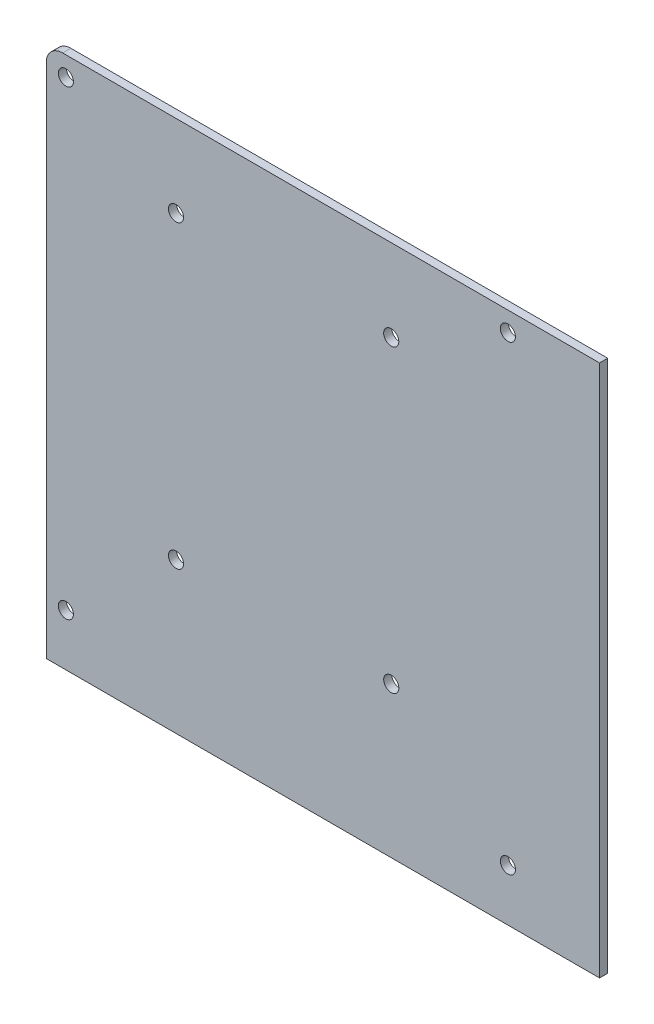
ISO-10303-21;
HEADER;
FILE_DESCRIPTION(('STEP AP214'),'2;1');
FILE_NAME('part.step','',(''),(''),'','','');
FILE_SCHEMA(('AUTOMOTIVE_DESIGN { 1 0 10303 214 1 1 1 1 }'));
ENDSEC;
DATA;
#1=APPLICATION_CONTEXT('core data for automotive mechanical design processes');
#2=APPLICATION_PROTOCOL_DEFINITION('international standard','automotive_design',2000,#1);
#3=PRODUCT_CONTEXT('',#1,'mechanical');
#4=PRODUCT('Part','Part','',(#3));
#5=PRODUCT_RELATED_PRODUCT_CATEGORY('part','',(#4));
#6=PRODUCT_DEFINITION_FORMATION('','',#4);
#7=PRODUCT_DEFINITION_CONTEXT('part definition',#1,'design');
#8=PRODUCT_DEFINITION('design','',#6,#7);
#9=PRODUCT_DEFINITION_SHAPE('','',#8);
#10=(LENGTH_UNIT() NAMED_UNIT(*) SI_UNIT(.MILLI.,.METRE.));
#11=(NAMED_UNIT(*) PLANE_ANGLE_UNIT() SI_UNIT($,.RADIAN.));
#12=(NAMED_UNIT(*) SI_UNIT($,.STERADIAN.) SOLID_ANGLE_UNIT());
#13=UNCERTAINTY_MEASURE_WITH_UNIT(LENGTH_MEASURE(1.E-05),#10,'distance_accuracy_value','');
#14=(GEOMETRIC_REPRESENTATION_CONTEXT(3) GLOBAL_UNCERTAINTY_ASSIGNED_CONTEXT((#13)) GLOBAL_UNIT_ASSIGNED_CONTEXT((#10,
#11,#12)) REPRESENTATION_CONTEXT('',''));
#15=CARTESIAN_POINT('',(0.,0.,0.));
#16=DIRECTION('',(0.,0.,1.));
#17=DIRECTION('',(1.,0.,0.));
#18=AXIS2_PLACEMENT_3D('',#15,#16,#17);
#19=CARTESIAN_POINT('',(0.,0.,1.5875));
#20=DIRECTION('',(1.,0.,0.));
#21=DIRECTION('',(0.,0.,-1.));
#22=AXIS2_PLACEMENT_3D('',#19,#20,#21);
#23=PLANE('',#22);
#24=DIRECTION('',(0.,0.,1.));
#25=VECTOR('',#24,1.);
#26=CARTESIAN_POINT('',(0.,277.294971959545,0.));
#27=LINE('',#26,#25);
#28=CARTESIAN_POINT('',(0.,277.294971959545,0.));
#29=VERTEX_POINT('',#28);
#30=CARTESIAN_POINT('',(0.,277.294971959545,1.5875));
#31=VERTEX_POINT('',#30);
#32=EDGE_CURVE('E123',#29,#31,#27,.T.);
#33=ORIENTED_EDGE('',*,*,#32,.T.);
#34=DIRECTION('',(0.,-1.,0.));
#35=VECTOR('',#34,1.);
#36=CARTESIAN_POINT('',(0.,0.,1.5875));
#37=LINE('',#36,#35);
#38=CARTESIAN_POINT('',(0.,377.825,1.5875));
#39=VERTEX_POINT('',#38);
#40=EDGE_CURVE('E97',#39,#31,#37,.T.);
#41=ORIENTED_EDGE('',*,*,#40,.F.);
#42=DIRECTION('',(0.,0.,-1.));
#43=VECTOR('',#42,1.);
#44=CARTESIAN_POINT('',(0.,377.825,1.5875));
#45=LINE('',#44,#43);
#46=CARTESIAN_POINT('',(0.,377.825,0.));
#47=VERTEX_POINT('',#46);
#48=EDGE_CURVE('E41',#39,#47,#45,.T.);
#49=ORIENTED_EDGE('',*,*,#48,.T.);
#50=DIRECTION('',(0.,-1.,0.));
#51=VECTOR('',#50,1.);
#52=CARTESIAN_POINT('',(0.,0.,0.));
#53=LINE('',#52,#51);
#54=EDGE_CURVE('E98',#47,#29,#53,.T.);
#55=ORIENTED_EDGE('',*,*,#54,.T.);
#56=EDGE_LOOP('',(#33,#41,#49,#55));
#57=FACE_BOUND('',#56,.T.);
#58=ADVANCED_FACE('F33',(#57),#23,.F.);
#59=CARTESIAN_POINT('',(0.,0.,1.5875));
#60=DIRECTION('',(0.,0.,-1.));
#61=DIRECTION('',(-1.,0.,0.));
#62=AXIS2_PLACEMENT_3D('',#59,#60,#61);
#63=PLANE('',#62);
#64=CARTESIAN_POINT('',(89.8652,377.19,1.5875));
#65=DIRECTION('',(0.,0.,1.));
#66=DIRECTION('',(-1.,0.,0.));
#67=AXIS2_PLACEMENT_3D('',#64,#65,#66);
#68=CIRCLE('',#67,1.47319999999994);
#69=CARTESIAN_POINT('',(88.3920000000001,377.19,1.5875));
#70=VERTEX_POINT('',#69);
#71=EDGE_CURVE('E166',#70,#70,#68,.T.);
#72=ORIENTED_EDGE('',*,*,#71,.F.);
#73=EDGE_LOOP('',(#72));
#74=FACE_BOUND('',#73,.T.);
#75=CARTESIAN_POINT('',(3.81,377.19,1.5875));
#76=DIRECTION('',(0.,0.,1.));
#77=DIRECTION('',(1.,0.,0.));
#78=AXIS2_PLACEMENT_3D('',#75,#76,#77);
#79=CIRCLE('',#78,1.47319999999995);
#80=CARTESIAN_POINT('',(5.28319999999995,377.19,1.5875));
#81=VERTEX_POINT('',#80);
#82=EDGE_CURVE('E160',#81,#81,#79,.T.);
#83=ORIENTED_EDGE('',*,*,#82,.F.);
#84=EDGE_LOOP('',(#83));
#85=FACE_BOUND('',#84,.T.);
#86=CARTESIAN_POINT('',(89.8652,287.3756,1.5875));
#87=DIRECTION('',(0.,0.,1.));
#88=DIRECTION('',(1.,0.,0.));
#89=AXIS2_PLACEMENT_3D('',#86,#87,#88);
#90=CIRCLE('',#89,1.47319999999997);
#91=CARTESIAN_POINT('',(91.3384,287.3756,1.5875));
#92=VERTEX_POINT('',#91);
#93=EDGE_CURVE('E154',#92,#92,#90,.T.);
#94=ORIENTED_EDGE('',*,*,#93,.F.);
#95=EDGE_LOOP('',(#94));
#96=FACE_BOUND('',#95,.T.);
#97=CARTESIAN_POINT('',(3.80999999999998,287.3756,1.5875));
#98=DIRECTION('',(0.,0.,1.));
#99=DIRECTION('',(1.,0.,0.));
#100=AXIS2_PLACEMENT_3D('',#97,#98,#99);
#101=CIRCLE('',#100,1.47319999999995);
#102=CARTESIAN_POINT('',(5.28319999999993,287.3756,1.5875));
#103=VERTEX_POINT('',#102);
#104=EDGE_CURVE('E148',#103,#103,#101,.T.);
#105=ORIENTED_EDGE('',*,*,#104,.F.);
#106=EDGE_LOOP('',(#105));
#107=FACE_BOUND('',#106,.T.);
#108=CARTESIAN_POINT('',(25.2476,365.0234,1.5875));
#109=DIRECTION('',(0.,0.,1.));
#110=DIRECTION('',(1.,0.,0.));
#111=AXIS2_PLACEMENT_3D('',#108,#109,#110);
#112=CIRCLE('',#111,1.4732);
#113=CARTESIAN_POINT('',(26.7208,365.0234,1.5875));
#114=VERTEX_POINT('',#113);
#115=EDGE_CURVE('E142',#114,#114,#112,.T.);
#116=ORIENTED_EDGE('',*,*,#115,.F.);
#117=EDGE_LOOP('',(#116));
#118=FACE_BOUND('',#117,.T.);
#119=CARTESIAN_POINT('',(67.1576,365.0234,1.5875));
#120=DIRECTION('',(0.,0.,1.));
#121=DIRECTION('',(-1.,0.,0.));
#122=AXIS2_PLACEMENT_3D('',#119,#120,#121);
#123=CIRCLE('',#122,1.4732);
#124=CARTESIAN_POINT('',(65.6844,365.0234,1.5875));
#125=VERTEX_POINT('',#124);
#126=EDGE_CURVE('E136',#125,#125,#123,.T.);
#127=ORIENTED_EDGE('',*,*,#126,.F.);
#128=EDGE_LOOP('',(#127));
#129=FACE_BOUND('',#128,.T.);
#130=CARTESIAN_POINT('',(67.1576,306.6034,1.5875));
#131=DIRECTION('',(0.,0.,1.));
#132=DIRECTION('',(1.,0.,0.));
#133=AXIS2_PLACEMENT_3D('',#130,#131,#132);
#134=CIRCLE('',#133,1.4732);
#135=CARTESIAN_POINT('',(68.6308,306.6034,1.5875));
#136=VERTEX_POINT('',#135);
#137=EDGE_CURVE('E130',#136,#136,#134,.T.);
#138=ORIENTED_EDGE('',*,*,#137,.F.);
#139=EDGE_LOOP('',(#138));
#140=FACE_BOUND('',#139,.T.);
#141=CARTESIAN_POINT('',(25.2476,306.6034,1.5875));
#142=DIRECTION('',(0.,0.,1.));
#143=DIRECTION('',(-1.,0.,0.));
#144=AXIS2_PLACEMENT_3D('',#141,#142,#143);
#145=CIRCLE('',#144,1.4732);
#146=CARTESIAN_POINT('',(23.7744,306.6034,1.5875));
#147=VERTEX_POINT('',#146);
#148=EDGE_CURVE('E125',#147,#147,#145,.T.);
#149=ORIENTED_EDGE('',*,*,#148,.F.);
#150=EDGE_LOOP('',(#149));
#151=FACE_BOUND('',#150,.T.);
#152=DIRECTION('',(1.,0.,0.));
#153=VECTOR('',#152,1.);
#154=CARTESIAN_POINT('',(0.,277.294971959545,1.5875));
#155=LINE('',#154,#153);
#156=CARTESIAN_POINT('',(107.714500618971,277.294971959545,1.5875));
#157=VERTEX_POINT('',#156);
#158=EDGE_CURVE('E86',#31,#157,#155,.T.);
#159=ORIENTED_EDGE('',*,*,#158,.T.);
#160=DIRECTION('',(0.,-1.,0.));
#161=VECTOR('',#160,1.);
#162=CARTESIAN_POINT('',(107.714500618971,0.,1.5875));
#163=LINE('',#162,#161);
#164=CARTESIAN_POINT('',(107.714500618971,381.,1.5875));
#165=VERTEX_POINT('',#164);
#166=EDGE_CURVE('E119',#165,#157,#163,.T.);
#167=ORIENTED_EDGE('',*,*,#166,.F.);
#168=DIRECTION('',(-1.,0.,0.));
#169=VECTOR('',#168,1.);
#170=CARTESIAN_POINT('',(0.,381.,1.5875));
#171=LINE('',#170,#169);
#172=CARTESIAN_POINT('',(3.175,381.,1.5875));
#173=VERTEX_POINT('',#172);
#174=EDGE_CURVE('E56',#165,#173,#171,.T.);
#175=ORIENTED_EDGE('',*,*,#174,.T.);
#176=CARTESIAN_POINT('',(3.175,377.825,1.5875));
#177=DIRECTION('',(0.,0.,-1.));
#178=DIRECTION('',(-1.,0.,0.));
#179=AXIS2_PLACEMENT_3D('',#176,#177,#178);
#180=CIRCLE('',#179,3.175);
#181=EDGE_CURVE('E108',#173,#39,#180,.F.);
#182=ORIENTED_EDGE('',*,*,#181,.T.);
#183=ORIENTED_EDGE('',*,*,#40,.T.);
#184=EDGE_LOOP('',(#159,#167,#175,#182,#183));
#185=FACE_BOUND('',#184,.T.);
#186=ADVANCED_FACE('F176',(#74,#85,#96,#107,#118,#129,#140,#151,#185),#63,.F.);
#187=CARTESIAN_POINT('',(0.,0.,0.));
#188=DIRECTION('',(0.,0.,-1.));
#189=DIRECTION('',(-1.,0.,0.));
#190=AXIS2_PLACEMENT_3D('',#187,#188,#189);
#191=PLANE('',#190);
#192=CARTESIAN_POINT('',(89.8652,377.19,0.));
#193=DIRECTION('',(0.,0.,1.));
#194=DIRECTION('',(-1.,0.,0.));
#195=AXIS2_PLACEMENT_3D('',#192,#193,#194);
#196=CIRCLE('',#195,1.47319999999994);
#197=CARTESIAN_POINT('',(88.3920000000001,377.19,0.));
#198=VERTEX_POINT('',#197);
#199=EDGE_CURVE('E103',#198,#198,#196,.T.);
#200=ORIENTED_EDGE('',*,*,#199,.T.);
#201=EDGE_LOOP('',(#200));
#202=FACE_BOUND('',#201,.T.);
#203=CARTESIAN_POINT('',(3.81,377.19,0.));
#204=DIRECTION('',(0.,0.,1.));
#205=DIRECTION('',(1.,0.,0.));
#206=AXIS2_PLACEMENT_3D('',#203,#204,#205);
#207=CIRCLE('',#206,1.47319999999995);
#208=CARTESIAN_POINT('',(5.28319999999995,377.19,0.));
#209=VERTEX_POINT('',#208);
#210=EDGE_CURVE('E163',#209,#209,#207,.T.);
#211=ORIENTED_EDGE('',*,*,#210,.T.);
#212=EDGE_LOOP('',(#211));
#213=FACE_BOUND('',#212,.T.);
#214=CARTESIAN_POINT('',(89.8652,287.3756,0.));
#215=DIRECTION('',(0.,0.,1.));
#216=DIRECTION('',(1.,0.,0.));
#217=AXIS2_PLACEMENT_3D('',#214,#215,#216);
#218=CIRCLE('',#217,1.47319999999997);
#219=CARTESIAN_POINT('',(91.3384,287.3756,0.));
#220=VERTEX_POINT('',#219);
#221=EDGE_CURVE('E157',#220,#220,#218,.T.);
#222=ORIENTED_EDGE('',*,*,#221,.T.);
#223=EDGE_LOOP('',(#222));
#224=FACE_BOUND('',#223,.T.);
#225=CARTESIAN_POINT('',(3.80999999999998,287.3756,0.));
#226=DIRECTION('',(0.,0.,1.));
#227=DIRECTION('',(1.,0.,0.));
#228=AXIS2_PLACEMENT_3D('',#225,#226,#227);
#229=CIRCLE('',#228,1.47319999999995);
#230=CARTESIAN_POINT('',(5.28319999999993,287.3756,0.));
#231=VERTEX_POINT('',#230);
#232=EDGE_CURVE('E151',#231,#231,#229,.T.);
#233=ORIENTED_EDGE('',*,*,#232,.T.);
#234=EDGE_LOOP('',(#233));
#235=FACE_BOUND('',#234,.T.);
#236=CARTESIAN_POINT('',(25.2476,365.0234,0.));
#237=DIRECTION('',(0.,0.,1.));
#238=DIRECTION('',(1.,0.,0.));
#239=AXIS2_PLACEMENT_3D('',#236,#237,#238);
#240=CIRCLE('',#239,1.4732);
#241=CARTESIAN_POINT('',(26.7208,365.0234,0.));
#242=VERTEX_POINT('',#241);
#243=EDGE_CURVE('E145',#242,#242,#240,.T.);
#244=ORIENTED_EDGE('',*,*,#243,.T.);
#245=EDGE_LOOP('',(#244));
#246=FACE_BOUND('',#245,.T.);
#247=CARTESIAN_POINT('',(67.1576,365.0234,0.));
#248=DIRECTION('',(0.,0.,1.));
#249=DIRECTION('',(-1.,0.,0.));
#250=AXIS2_PLACEMENT_3D('',#247,#248,#249);
#251=CIRCLE('',#250,1.4732);
#252=CARTESIAN_POINT('',(65.6844,365.0234,0.));
#253=VERTEX_POINT('',#252);
#254=EDGE_CURVE('E139',#253,#253,#251,.T.);
#255=ORIENTED_EDGE('',*,*,#254,.T.);
#256=EDGE_LOOP('',(#255));
#257=FACE_BOUND('',#256,.T.);
#258=CARTESIAN_POINT('',(67.1576,306.6034,0.));
#259=DIRECTION('',(0.,0.,1.));
#260=DIRECTION('',(1.,0.,0.));
#261=AXIS2_PLACEMENT_3D('',#258,#259,#260);
#262=CIRCLE('',#261,1.4732);
#263=CARTESIAN_POINT('',(68.6308,306.6034,0.));
#264=VERTEX_POINT('',#263);
#265=EDGE_CURVE('E133',#264,#264,#262,.T.);
#266=ORIENTED_EDGE('',*,*,#265,.T.);
#267=EDGE_LOOP('',(#266));
#268=FACE_BOUND('',#267,.T.);
#269=CARTESIAN_POINT('',(25.2476,306.6034,0.));
#270=DIRECTION('',(0.,0.,1.));
#271=DIRECTION('',(-1.,0.,0.));
#272=AXIS2_PLACEMENT_3D('',#269,#270,#271);
#273=CIRCLE('',#272,1.4732);
#274=CARTESIAN_POINT('',(23.7744,306.6034,0.));
#275=VERTEX_POINT('',#274);
#276=EDGE_CURVE('E127',#275,#275,#273,.T.);
#277=ORIENTED_EDGE('',*,*,#276,.T.);
#278=EDGE_LOOP('',(#277));
#279=FACE_BOUND('',#278,.T.);
#280=DIRECTION('',(0.,-1.,0.));
#281=VECTOR('',#280,1.);
#282=CARTESIAN_POINT('',(107.714500618971,0.,0.));
#283=LINE('',#282,#281);
#284=CARTESIAN_POINT('',(107.714500618971,381.,0.));
#285=VERTEX_POINT('',#284);
#286=CARTESIAN_POINT('',(107.714500618971,277.294971959545,0.));
#287=VERTEX_POINT('',#286);
#288=EDGE_CURVE('E78',#285,#287,#283,.T.);
#289=ORIENTED_EDGE('',*,*,#288,.T.);
#290=DIRECTION('',(1.,0.,0.));
#291=VECTOR('',#290,1.);
#292=CARTESIAN_POINT('',(0.,277.294971959545,0.));
#293=LINE('',#292,#291);
#294=EDGE_CURVE('E85',#29,#287,#293,.T.);
#295=ORIENTED_EDGE('',*,*,#294,.F.);
#296=ORIENTED_EDGE('',*,*,#54,.F.);
#297=CARTESIAN_POINT('',(3.175,377.825,0.));
#298=DIRECTION('',(0.,0.,-1.));
#299=DIRECTION('',(-1.,0.,0.));
#300=AXIS2_PLACEMENT_3D('',#297,#298,#299);
#301=CIRCLE('',#300,3.175);
#302=CARTESIAN_POINT('',(3.175,381.,0.));
#303=VERTEX_POINT('',#302);
#304=EDGE_CURVE('E95',#47,#303,#301,.T.);
#305=ORIENTED_EDGE('',*,*,#304,.T.);
#306=DIRECTION('',(-1.,0.,0.));
#307=VECTOR('',#306,1.);
#308=CARTESIAN_POINT('',(0.,381.,0.));
#309=LINE('',#308,#307);
#310=EDGE_CURVE('E90',#285,#303,#309,.T.);
#311=ORIENTED_EDGE('',*,*,#310,.F.);
#312=EDGE_LOOP('',(#289,#295,#296,#305,#311));
#313=FACE_BOUND('',#312,.T.);
#314=ADVANCED_FACE('F93',(#202,#213,#224,#235,#246,#257,#268,#279,#313),#191,.T.);
#315=CARTESIAN_POINT('',(0.,381.,1.5875));
#316=DIRECTION('',(0.,-1.,0.));
#317=DIRECTION('',(0.,0.,-1.));
#318=AXIS2_PLACEMENT_3D('',#315,#316,#317);
#319=PLANE('',#318);
#320=ORIENTED_EDGE('',*,*,#174,.F.);
#321=DIRECTION('',(0.,0.,1.));
#322=VECTOR('',#321,1.);
#323=CARTESIAN_POINT('',(107.714500618971,381.,0.));
#324=LINE('',#323,#322);
#325=EDGE_CURVE('E81',#285,#165,#324,.T.);
#326=ORIENTED_EDGE('',*,*,#325,.F.);
#327=ORIENTED_EDGE('',*,*,#310,.T.);
#328=DIRECTION('',(0.,0.,-1.));
#329=VECTOR('',#328,1.);
#330=CARTESIAN_POINT('',(3.175,381.,1.5875));
#331=LINE('',#330,#329);
#332=EDGE_CURVE('E11',#303,#173,#331,.F.);
#333=ORIENTED_EDGE('',*,*,#332,.T.);
#334=EDGE_LOOP('',(#320,#326,#327,#333));
#335=FACE_BOUND('',#334,.T.);
#336=ADVANCED_FACE('F89',(#335),#319,.F.);
#337=CARTESIAN_POINT('',(89.8652,377.19,0.));
#338=DIRECTION('',(0.,0.,1.));
#339=DIRECTION('',(1.,0.,0.));
#340=AXIS2_PLACEMENT_3D('',#337,#338,#339);
#341=CYLINDRICAL_SURFACE('',#340,1.47319999999994);
#342=ORIENTED_EDGE('',*,*,#199,.F.);
#343=EDGE_LOOP('',(#342));
#344=FACE_BOUND('',#343,.T.);
#345=ORIENTED_EDGE('',*,*,#71,.T.);
#346=EDGE_LOOP('',(#345));
#347=FACE_BOUND('',#346,.T.);
#348=ADVANCED_FACE('F174',(#344,#347),#341,.F.);
#349=CARTESIAN_POINT('',(3.81,377.19,0.));
#350=DIRECTION('',(0.,0.,1.));
#351=DIRECTION('',(1.,0.,0.));
#352=AXIS2_PLACEMENT_3D('',#349,#350,#351);
#353=CYLINDRICAL_SURFACE('',#352,1.47319999999995);
#354=ORIENTED_EDGE('',*,*,#210,.F.);
#355=EDGE_LOOP('',(#354));
#356=FACE_BOUND('',#355,.T.);
#357=ORIENTED_EDGE('',*,*,#82,.T.);
#358=EDGE_LOOP('',(#357));
#359=FACE_BOUND('',#358,.T.);
#360=ADVANCED_FACE('F216',(#356,#359),#353,.F.);
#361=CARTESIAN_POINT('',(89.8652,287.3756,0.));
#362=DIRECTION('',(0.,0.,1.));
#363=DIRECTION('',(1.,0.,0.));
#364=AXIS2_PLACEMENT_3D('',#361,#362,#363);
#365=CYLINDRICAL_SURFACE('',#364,1.47319999999997);
#366=ORIENTED_EDGE('',*,*,#221,.F.);
#367=EDGE_LOOP('',(#366));
#368=FACE_BOUND('',#367,.T.);
#369=ORIENTED_EDGE('',*,*,#93,.T.);
#370=EDGE_LOOP('',(#369));
#371=FACE_BOUND('',#370,.T.);
#372=ADVANCED_FACE('F220',(#368,#371),#365,.F.);
#373=CARTESIAN_POINT('',(3.80999999999998,287.3756,0.));
#374=DIRECTION('',(0.,0.,1.));
#375=DIRECTION('',(1.,0.,0.));
#376=AXIS2_PLACEMENT_3D('',#373,#374,#375);
#377=CYLINDRICAL_SURFACE('',#376,1.47319999999995);
#378=ORIENTED_EDGE('',*,*,#232,.F.);
#379=EDGE_LOOP('',(#378));
#380=FACE_BOUND('',#379,.T.);
#381=ORIENTED_EDGE('',*,*,#104,.T.);
#382=EDGE_LOOP('',(#381));
#383=FACE_BOUND('',#382,.T.);
#384=ADVANCED_FACE('F224',(#380,#383),#377,.F.);
#385=CARTESIAN_POINT('',(3.175,377.825,1.5875));
#386=DIRECTION('',(0.,0.,-1.));
#387=DIRECTION('',(-1.,0.,0.));
#388=AXIS2_PLACEMENT_3D('',#385,#386,#387);
#389=CYLINDRICAL_SURFACE('',#388,3.175);
#390=ORIENTED_EDGE('',*,*,#181,.F.);
#391=ORIENTED_EDGE('',*,*,#332,.F.);
#392=ORIENTED_EDGE('',*,*,#304,.F.);
#393=ORIENTED_EDGE('',*,*,#48,.F.);
#394=EDGE_LOOP('',(#390,#391,#392,#393));
#395=FACE_BOUND('',#394,.T.);
#396=ADVANCED_FACE('F35',(#395),#389,.T.);
#397=CARTESIAN_POINT('',(25.2476,365.0234,0.));
#398=DIRECTION('',(0.,0.,1.));
#399=DIRECTION('',(1.,0.,0.));
#400=AXIS2_PLACEMENT_3D('',#397,#398,#399);
#401=CYLINDRICAL_SURFACE('',#400,1.4732);
#402=ORIENTED_EDGE('',*,*,#243,.F.);
#403=EDGE_LOOP('',(#402));
#404=FACE_BOUND('',#403,.T.);
#405=ORIENTED_EDGE('',*,*,#115,.T.);
#406=EDGE_LOOP('',(#405));
#407=FACE_BOUND('',#406,.T.);
#408=ADVANCED_FACE('F229',(#404,#407),#401,.F.);
#409=CARTESIAN_POINT('',(67.1576,365.0234,0.));
#410=DIRECTION('',(0.,0.,1.));
#411=DIRECTION('',(1.,0.,0.));
#412=AXIS2_PLACEMENT_3D('',#409,#410,#411);
#413=CYLINDRICAL_SURFACE('',#412,1.4732);
#414=ORIENTED_EDGE('',*,*,#254,.F.);
#415=EDGE_LOOP('',(#414));
#416=FACE_BOUND('',#415,.T.);
#417=ORIENTED_EDGE('',*,*,#126,.T.);
#418=EDGE_LOOP('',(#417));
#419=FACE_BOUND('',#418,.T.);
#420=ADVANCED_FACE('F232',(#416,#419),#413,.F.);
#421=CARTESIAN_POINT('',(67.1576,306.6034,0.));
#422=DIRECTION('',(0.,0.,1.));
#423=DIRECTION('',(1.,0.,0.));
#424=AXIS2_PLACEMENT_3D('',#421,#422,#423);
#425=CYLINDRICAL_SURFACE('',#424,1.4732);
#426=ORIENTED_EDGE('',*,*,#265,.F.);
#427=EDGE_LOOP('',(#426));
#428=FACE_BOUND('',#427,.T.);
#429=ORIENTED_EDGE('',*,*,#137,.T.);
#430=EDGE_LOOP('',(#429));
#431=FACE_BOUND('',#430,.T.);
#432=ADVANCED_FACE('F202',(#428,#431),#425,.F.);
#433=CARTESIAN_POINT('',(25.2476,306.6034,0.));
#434=DIRECTION('',(0.,0.,1.));
#435=DIRECTION('',(1.,0.,0.));
#436=AXIS2_PLACEMENT_3D('',#433,#434,#435);
#437=CYLINDRICAL_SURFACE('',#436,1.4732);
#438=ORIENTED_EDGE('',*,*,#276,.F.);
#439=EDGE_LOOP('',(#438));
#440=FACE_BOUND('',#439,.T.);
#441=ORIENTED_EDGE('',*,*,#148,.T.);
#442=EDGE_LOOP('',(#441));
#443=FACE_BOUND('',#442,.T.);
#444=ADVANCED_FACE('F195',(#440,#443),#437,.F.);
#445=CARTESIAN_POINT('',(0.,277.294971959545,0.));
#446=DIRECTION('',(0.,-1.,0.));
#447=DIRECTION('',(0.,0.,-1.));
#448=AXIS2_PLACEMENT_3D('',#445,#446,#447);
#449=PLANE('',#448);
#450=ORIENTED_EDGE('',*,*,#158,.F.);
#451=ORIENTED_EDGE('',*,*,#32,.F.);
#452=ORIENTED_EDGE('',*,*,#294,.T.);
#453=DIRECTION('',(0.,0.,1.));
#454=VECTOR('',#453,1.);
#455=CARTESIAN_POINT('',(107.714500618971,277.294971959545,0.));
#456=LINE('',#455,#454);
#457=EDGE_CURVE('E48',#287,#157,#456,.T.);
#458=ORIENTED_EDGE('',*,*,#457,.T.);
#459=EDGE_LOOP('',(#450,#451,#452,#458));
#460=FACE_BOUND('',#459,.T.);
#461=ADVANCED_FACE('F193',(#460),#449,.T.);
#462=CARTESIAN_POINT('',(107.714500618971,0.,0.));
#463=DIRECTION('',(-1.,0.,0.));
#464=DIRECTION('',(0.,0.,1.));
#465=AXIS2_PLACEMENT_3D('',#462,#463,#464);
#466=PLANE('',#465);
#467=ORIENTED_EDGE('',*,*,#166,.T.);
#468=ORIENTED_EDGE('',*,*,#457,.F.);
#469=ORIENTED_EDGE('',*,*,#288,.F.);
#470=ORIENTED_EDGE('',*,*,#325,.T.);
#471=EDGE_LOOP('',(#467,#468,#469,#470));
#472=FACE_BOUND('',#471,.T.);
#473=ADVANCED_FACE('F80',(#472),#466,.F.);
#474=CLOSED_SHELL('',(#58,#186,#314,#336,#348,#360,#372,#384,#396,#408,#420,#432,#444,#461,#473));
#475=MANIFOLD_SOLID_BREP('B2',#474);
#476=ADVANCED_BREP_SHAPE_REPRESENTATION('',(#18,#475),#14);
#477=SHAPE_DEFINITION_REPRESENTATION(#9,#476);
ENDSEC;
END-ISO-10303-21;
